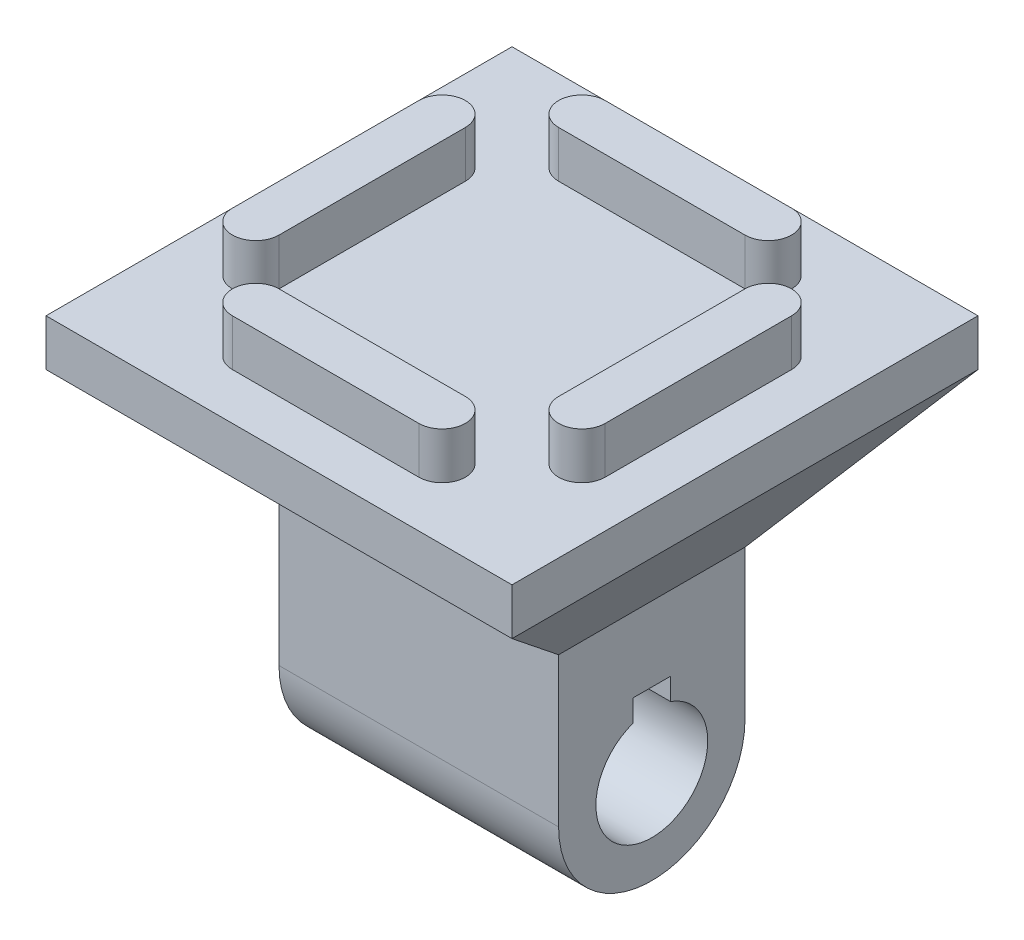
ISO-10303-21;
HEADER;
FILE_DESCRIPTION(('STEP AP214'),'2;1');
FILE_NAME('part.step','',(''),(''),'','','');
FILE_SCHEMA(('AUTOMOTIVE_DESIGN { 1 0 10303 214 1 1 1 1 }'));
ENDSEC;
DATA;
#1=APPLICATION_CONTEXT('core data for automotive mechanical design processes');
#2=APPLICATION_PROTOCOL_DEFINITION('international standard','automotive_design',2000,#1);
#3=PRODUCT_CONTEXT('',#1,'mechanical');
#4=PRODUCT('Part','Part','',(#3));
#5=PRODUCT_RELATED_PRODUCT_CATEGORY('part','',(#4));
#6=PRODUCT_DEFINITION_FORMATION('','',#4);
#7=PRODUCT_DEFINITION_CONTEXT('part definition',#1,'design');
#8=PRODUCT_DEFINITION('design','',#6,#7);
#9=PRODUCT_DEFINITION_SHAPE('','',#8);
#10=(LENGTH_UNIT() NAMED_UNIT(*) SI_UNIT(.MILLI.,.METRE.));
#11=(NAMED_UNIT(*) PLANE_ANGLE_UNIT() SI_UNIT($,.RADIAN.));
#12=(NAMED_UNIT(*) SI_UNIT($,.STERADIAN.) SOLID_ANGLE_UNIT());
#13=UNCERTAINTY_MEASURE_WITH_UNIT(LENGTH_MEASURE(1.E-05),#10,'distance_accuracy_value','');
#14=(GEOMETRIC_REPRESENTATION_CONTEXT(3) GLOBAL_UNCERTAINTY_ASSIGNED_CONTEXT((#13)) GLOBAL_UNIT_ASSIGNED_CONTEXT((#10,
#11,#12)) REPRESENTATION_CONTEXT('',''));
#15=CARTESIAN_POINT('',(0.,0.,0.));
#16=DIRECTION('',(0.,0.,1.));
#17=DIRECTION('',(1.,0.,0.));
#18=AXIS2_PLACEMENT_3D('',#15,#16,#17);
#19=CARTESIAN_POINT('',(0.,5.,0.));
#20=DIRECTION('',(0.,-1.,0.));
#21=DIRECTION('',(0.,0.,-1.));
#22=AXIS2_PLACEMENT_3D('',#19,#20,#21);
#23=PLANE('',#22);
#24=CARTESIAN_POINT('',(17.5,5.,10.));
#25=DIRECTION('',(0.,1.,0.));
#26=DIRECTION('',(0.,0.,-1.));
#27=AXIS2_PLACEMENT_3D('',#24,#25,#26);
#28=CIRCLE('',#27,2.50000000000001);
#29=CARTESIAN_POINT('',(15.,5.,10.));
#30=VERTEX_POINT('',#29);
#31=CARTESIAN_POINT('',(20.,5.,10.));
#32=VERTEX_POINT('',#31);
#33=EDGE_CURVE('E228',#30,#32,#28,.T.);
#34=ORIENTED_EDGE('',*,*,#33,.F.);
#35=DIRECTION('',(0.,0.,1.));
#36=VECTOR('',#35,1.);
#37=CARTESIAN_POINT('',(15.,5.,10.));
#38=LINE('',#37,#36);
#39=CARTESIAN_POINT('',(15.,5.,-10.));
#40=VERTEX_POINT('',#39);
#41=EDGE_CURVE('E233',#40,#30,#38,.T.);
#42=ORIENTED_EDGE('',*,*,#41,.F.);
#43=CARTESIAN_POINT('',(17.5,5.,-10.));
#44=DIRECTION('',(0.,1.,0.));
#45=DIRECTION('',(0.,0.,-1.));
#46=AXIS2_PLACEMENT_3D('',#43,#44,#45);
#47=CIRCLE('',#46,2.50000000000001);
#48=CARTESIAN_POINT('',(20.,5.,-10.));
#49=VERTEX_POINT('',#48);
#50=EDGE_CURVE('E245',#49,#40,#47,.T.);
#51=ORIENTED_EDGE('',*,*,#50,.F.);
#52=DIRECTION('',(0.,0.,-1.));
#53=VECTOR('',#52,1.);
#54=CARTESIAN_POINT('',(20.,5.,10.));
#55=LINE('',#54,#53);
#56=EDGE_CURVE('E242',#32,#49,#55,.T.);
#57=ORIENTED_EDGE('',*,*,#56,.F.);
#58=EDGE_LOOP('',(#34,#42,#51,#57));
#59=FACE_BOUND('',#58,.T.);
#60=CARTESIAN_POINT('',(-17.5,5.,-10.));
#61=DIRECTION('',(0.,1.,0.));
#62=DIRECTION('',(0.,0.,1.));
#63=AXIS2_PLACEMENT_3D('',#60,#61,#62);
#64=CIRCLE('',#63,2.50000000000001);
#65=CARTESIAN_POINT('',(-15.,5.,-10.));
#66=VERTEX_POINT('',#65);
#67=CARTESIAN_POINT('',(-20.,5.,-10.));
#68=VERTEX_POINT('',#67);
#69=EDGE_CURVE('E294',#66,#68,#64,.T.);
#70=ORIENTED_EDGE('',*,*,#69,.F.);
#71=DIRECTION('',(0.,0.,-1.));
#72=VECTOR('',#71,1.);
#73=CARTESIAN_POINT('',(-15.,5.,-10.));
#74=LINE('',#73,#72);
#75=CARTESIAN_POINT('',(-15.,5.,10.));
#76=VERTEX_POINT('',#75);
#77=EDGE_CURVE('E299',#76,#66,#74,.T.);
#78=ORIENTED_EDGE('',*,*,#77,.F.);
#79=CARTESIAN_POINT('',(-17.5,5.,10.));
#80=DIRECTION('',(0.,1.,0.));
#81=DIRECTION('',(0.,0.,1.));
#82=AXIS2_PLACEMENT_3D('',#79,#80,#81);
#83=CIRCLE('',#82,2.50000000000001);
#84=CARTESIAN_POINT('',(-20.,5.,10.));
#85=VERTEX_POINT('',#84);
#86=EDGE_CURVE('E311',#85,#76,#83,.T.);
#87=ORIENTED_EDGE('',*,*,#86,.F.);
#88=DIRECTION('',(0.,0.,1.));
#89=VECTOR('',#88,1.);
#90=CARTESIAN_POINT('',(-20.,5.,-10.));
#91=LINE('',#90,#89);
#92=EDGE_CURVE('E308',#68,#85,#91,.T.);
#93=ORIENTED_EDGE('',*,*,#92,.F.);
#94=EDGE_LOOP('',(#70,#78,#87,#93));
#95=FACE_BOUND('',#94,.T.);
#96=DIRECTION('',(0.,0.,-1.));
#97=VECTOR('',#96,1.);
#98=CARTESIAN_POINT('',(25.,5.,25.));
#99=LINE('',#98,#97);
#100=CARTESIAN_POINT('',(25.,5.,25.));
#101=VERTEX_POINT('',#100);
#102=CARTESIAN_POINT('',(25.,5.,-25.));
#103=VERTEX_POINT('',#102);
#104=EDGE_CURVE('E327',#101,#103,#99,.T.);
#105=ORIENTED_EDGE('',*,*,#104,.T.);
#106=DIRECTION('',(-1.,0.,0.));
#107=VECTOR('',#106,1.);
#108=CARTESIAN_POINT('',(-25.,5.,-25.));
#109=LINE('',#108,#107);
#110=CARTESIAN_POINT('',(-25.,5.,-25.));
#111=VERTEX_POINT('',#110);
#112=EDGE_CURVE('E330',#103,#111,#109,.T.);
#113=ORIENTED_EDGE('',*,*,#112,.T.);
#114=DIRECTION('',(0.,0.,1.));
#115=VECTOR('',#114,1.);
#116=CARTESIAN_POINT('',(-25.,5.,25.));
#117=LINE('',#116,#115);
#118=CARTESIAN_POINT('',(-25.,5.,25.));
#119=VERTEX_POINT('',#118);
#120=EDGE_CURVE('E333',#111,#119,#117,.T.);
#121=ORIENTED_EDGE('',*,*,#120,.T.);
#122=DIRECTION('',(1.,0.,0.));
#123=VECTOR('',#122,1.);
#124=CARTESIAN_POINT('',(-25.,5.,25.));
#125=LINE('',#124,#123);
#126=EDGE_CURVE('E335',#119,#101,#125,.T.);
#127=ORIENTED_EDGE('',*,*,#126,.T.);
#128=EDGE_LOOP('',(#105,#113,#121,#127));
#129=FACE_BOUND('',#128,.T.);
#130=CARTESIAN_POINT('',(-9.99999999999994,5.,17.5));
#131=DIRECTION('',(0.,1.,0.));
#132=DIRECTION('',(1.,0.,0.));
#133=AXIS2_PLACEMENT_3D('',#130,#131,#132);
#134=CIRCLE('',#133,2.50000000000001);
#135=CARTESIAN_POINT('',(-9.99999999999995,5.,15.));
#136=VERTEX_POINT('',#135);
#137=CARTESIAN_POINT('',(-9.99999999999993,5.,20.));
#138=VERTEX_POINT('',#137);
#139=EDGE_CURVE('E261',#136,#138,#134,.T.);
#140=ORIENTED_EDGE('',*,*,#139,.F.);
#141=DIRECTION('',(-1.,0.,0.));
#142=VECTOR('',#141,1.);
#143=CARTESIAN_POINT('',(-9.99999999999995,5.,15.));
#144=LINE('',#143,#142);
#145=CARTESIAN_POINT('',(10.0000000000001,5.,15.));
#146=VERTEX_POINT('',#145);
#147=EDGE_CURVE('E266',#146,#136,#144,.T.);
#148=ORIENTED_EDGE('',*,*,#147,.F.);
#149=CARTESIAN_POINT('',(10.0000000000001,5.,17.5));
#150=DIRECTION('',(0.,1.,0.));
#151=DIRECTION('',(1.,0.,0.));
#152=AXIS2_PLACEMENT_3D('',#149,#150,#151);
#153=CIRCLE('',#152,2.50000000000001);
#154=CARTESIAN_POINT('',(10.0000000000001,5.,20.));
#155=VERTEX_POINT('',#154);
#156=EDGE_CURVE('E278',#155,#146,#153,.T.);
#157=ORIENTED_EDGE('',*,*,#156,.F.);
#158=DIRECTION('',(1.,0.,0.));
#159=VECTOR('',#158,1.);
#160=CARTESIAN_POINT('',(-9.99999999999993,5.,20.));
#161=LINE('',#160,#159);
#162=EDGE_CURVE('E275',#138,#155,#161,.T.);
#163=ORIENTED_EDGE('',*,*,#162,.F.);
#164=EDGE_LOOP('',(#140,#148,#157,#163));
#165=FACE_BOUND('',#164,.T.);
#166=CARTESIAN_POINT('',(9.99999999999982,5.,-17.5000000000001));
#167=DIRECTION('',(0.,1.,0.));
#168=DIRECTION('',(-1.,0.,0.));
#169=AXIS2_PLACEMENT_3D('',#166,#167,#168);
#170=CIRCLE('',#169,2.50000000000001);
#171=CARTESIAN_POINT('',(9.99999999999984,5.,-15.0000000000001));
#172=VERTEX_POINT('',#171);
#173=CARTESIAN_POINT('',(9.99999999999979,5.,-20.0000000000001));
#174=VERTEX_POINT('',#173);
#175=EDGE_CURVE('E202',#172,#174,#170,.T.);
#176=ORIENTED_EDGE('',*,*,#175,.F.);
#177=DIRECTION('',(1.,0.,0.));
#178=VECTOR('',#177,1.);
#179=CARTESIAN_POINT('',(9.99999999999984,5.,-15.0000000000001));
#180=LINE('',#179,#178);
#181=CARTESIAN_POINT('',(-10.0000000000002,5.,-14.9999999999999));
#182=VERTEX_POINT('',#181);
#183=EDGE_CURVE('E198',#182,#172,#180,.T.);
#184=ORIENTED_EDGE('',*,*,#183,.F.);
#185=CARTESIAN_POINT('',(-10.0000000000002,5.,-17.4999999999999));
#186=DIRECTION('',(0.,1.,0.));
#187=DIRECTION('',(-1.,0.,0.));
#188=AXIS2_PLACEMENT_3D('',#185,#186,#187);
#189=CIRCLE('',#188,2.50000000000001);
#190=CARTESIAN_POINT('',(-10.0000000000002,5.,-19.9999999999999));
#191=VERTEX_POINT('',#190);
#192=EDGE_CURVE('E200',#191,#182,#189,.T.);
#193=ORIENTED_EDGE('',*,*,#192,.F.);
#194=DIRECTION('',(-1.,0.,0.));
#195=VECTOR('',#194,1.);
#196=CARTESIAN_POINT('',(9.99999999999979,5.,-20.0000000000001));
#197=LINE('',#196,#195);
#198=EDGE_CURVE('E64',#174,#191,#197,.T.);
#199=ORIENTED_EDGE('',*,*,#198,.F.);
#200=EDGE_LOOP('',(#176,#184,#193,#199));
#201=FACE_BOUND('',#200,.T.);
#202=ADVANCED_FACE('F40',(#59,#95,#129,#165,#201),#23,.F.);
#203=CARTESIAN_POINT('',(25.,5.,25.));
#204=DIRECTION('',(-1.,0.,0.));
#205=DIRECTION('',(0.,0.,1.));
#206=AXIS2_PLACEMENT_3D('',#203,#204,#205);
#207=PLANE('',#206);
#208=DIRECTION('',(0.,0.,1.));
#209=VECTOR('',#208,1.);
#210=CARTESIAN_POINT('',(25.,0.,25.));
#211=LINE('',#210,#209);
#212=CARTESIAN_POINT('',(25.,0.,25.));
#213=VERTEX_POINT('',#212);
#214=CARTESIAN_POINT('',(25.,0.,-25.));
#215=VERTEX_POINT('',#214);
#216=EDGE_CURVE('E87',#213,#215,#211,.F.);
#217=ORIENTED_EDGE('',*,*,#216,.T.);
#218=DIRECTION('',(0.,-1.,0.));
#219=VECTOR('',#218,1.);
#220=CARTESIAN_POINT('',(25.,5.,-25.));
#221=LINE('',#220,#219);
#222=EDGE_CURVE('E341',#103,#215,#221,.T.);
#223=ORIENTED_EDGE('',*,*,#222,.F.);
#224=ORIENTED_EDGE('',*,*,#104,.F.);
#225=DIRECTION('',(0.,-1.,0.));
#226=VECTOR('',#225,1.);
#227=CARTESIAN_POINT('',(25.,5.,25.));
#228=LINE('',#227,#226);
#229=EDGE_CURVE('E337',#101,#213,#228,.T.);
#230=ORIENTED_EDGE('',*,*,#229,.T.);
#231=EDGE_LOOP('',(#217,#223,#224,#230));
#232=FACE_BOUND('',#231,.T.);
#233=ADVANCED_FACE('F42',(#232),#207,.F.);
#234=CARTESIAN_POINT('',(-25.,5.,-25.));
#235=DIRECTION('',(0.,0.,1.));
#236=DIRECTION('',(1.,0.,0.));
#237=AXIS2_PLACEMENT_3D('',#234,#235,#236);
#238=PLANE('',#237);
#239=DIRECTION('',(1.,0.,0.));
#240=VECTOR('',#239,1.);
#241=CARTESIAN_POINT('',(-25.,0.,-25.));
#242=LINE('',#241,#240);
#243=CARTESIAN_POINT('',(-25.,0.,-25.));
#244=VERTEX_POINT('',#243);
#245=EDGE_CURVE('E350',#215,#244,#242,.F.);
#246=ORIENTED_EDGE('',*,*,#245,.T.);
#247=DIRECTION('',(0.,-1.,0.));
#248=VECTOR('',#247,1.);
#249=CARTESIAN_POINT('',(-25.,5.,-25.));
#250=LINE('',#249,#248);
#251=EDGE_CURVE('E338',#111,#244,#250,.T.);
#252=ORIENTED_EDGE('',*,*,#251,.F.);
#253=ORIENTED_EDGE('',*,*,#112,.F.);
#254=ORIENTED_EDGE('',*,*,#222,.T.);
#255=EDGE_LOOP('',(#246,#252,#253,#254));
#256=FACE_BOUND('',#255,.T.);
#257=ADVANCED_FACE('F580',(#256),#238,.F.);
#258=CARTESIAN_POINT('',(-25.,5.,25.));
#259=DIRECTION('',(1.,0.,0.));
#260=DIRECTION('',(0.,0.,-1.));
#261=AXIS2_PLACEMENT_3D('',#258,#259,#260);
#262=PLANE('',#261);
#263=DIRECTION('',(0.,0.,-1.));
#264=VECTOR('',#263,1.);
#265=CARTESIAN_POINT('',(-25.,0.,25.));
#266=LINE('',#265,#264);
#267=CARTESIAN_POINT('',(-25.,0.,25.));
#268=VERTEX_POINT('',#267);
#269=EDGE_CURVE('E353',#244,#268,#266,.F.);
#270=ORIENTED_EDGE('',*,*,#269,.T.);
#271=DIRECTION('',(0.,-1.,0.));
#272=VECTOR('',#271,1.);
#273=CARTESIAN_POINT('',(-25.,5.,25.));
#274=LINE('',#273,#272);
#275=EDGE_CURVE('E342',#119,#268,#274,.T.);
#276=ORIENTED_EDGE('',*,*,#275,.F.);
#277=ORIENTED_EDGE('',*,*,#120,.F.);
#278=ORIENTED_EDGE('',*,*,#251,.T.);
#279=EDGE_LOOP('',(#270,#276,#277,#278));
#280=FACE_BOUND('',#279,.T.);
#281=ADVANCED_FACE('F577',(#280),#262,.F.);
#282=CARTESIAN_POINT('',(-25.,5.,25.));
#283=DIRECTION('',(0.,0.,-1.));
#284=DIRECTION('',(-1.,0.,0.));
#285=AXIS2_PLACEMENT_3D('',#282,#283,#284);
#286=PLANE('',#285);
#287=DIRECTION('',(-1.,0.,0.));
#288=VECTOR('',#287,1.);
#289=CARTESIAN_POINT('',(-25.,0.,25.));
#290=LINE('',#289,#288);
#291=EDGE_CURVE('E331',#268,#213,#290,.F.);
#292=ORIENTED_EDGE('',*,*,#291,.T.);
#293=ORIENTED_EDGE('',*,*,#229,.F.);
#294=ORIENTED_EDGE('',*,*,#126,.F.);
#295=ORIENTED_EDGE('',*,*,#275,.T.);
#296=EDGE_LOOP('',(#292,#293,#294,#295));
#297=FACE_BOUND('',#296,.T.);
#298=ADVANCED_FACE('F570',(#297),#286,.F.);
#299=CARTESIAN_POINT('',(-17.5,10.,-10.));
#300=DIRECTION('',(0.,-1.,0.));
#301=DIRECTION('',(0.,0.,-1.));
#302=AXIS2_PLACEMENT_3D('',#299,#300,#301);
#303=CYLINDRICAL_SURFACE('',#302,2.50000000000001);
#304=ORIENTED_EDGE('',*,*,#69,.T.);
#305=DIRECTION('',(0.,-1.,0.));
#306=VECTOR('',#305,1.);
#307=CARTESIAN_POINT('',(-20.,10.,-10.));
#308=LINE('',#307,#306);
#309=CARTESIAN_POINT('',(-20.,10.,-10.));
#310=VERTEX_POINT('',#309);
#311=EDGE_CURVE('E324',#310,#68,#308,.T.);
#312=ORIENTED_EDGE('',*,*,#311,.F.);
#313=CARTESIAN_POINT('',(-17.5,10.,-10.));
#314=DIRECTION('',(0.,1.,0.));
#315=DIRECTION('',(0.,0.,1.));
#316=AXIS2_PLACEMENT_3D('',#313,#314,#315);
#317=CIRCLE('',#316,2.50000000000001);
#318=CARTESIAN_POINT('',(-15.,10.,-10.));
#319=VERTEX_POINT('',#318);
#320=EDGE_CURVE('E295',#319,#310,#317,.T.);
#321=ORIENTED_EDGE('',*,*,#320,.F.);
#322=DIRECTION('',(0.,-1.,0.));
#323=VECTOR('',#322,1.);
#324=CARTESIAN_POINT('',(-15.,10.,-10.));
#325=LINE('',#324,#323);
#326=EDGE_CURVE('E305',#319,#66,#325,.T.);
#327=ORIENTED_EDGE('',*,*,#326,.T.);
#328=EDGE_LOOP('',(#304,#312,#321,#327));
#329=FACE_BOUND('',#328,.T.);
#330=ADVANCED_FACE('F566',(#329),#303,.T.);
#331=CARTESIAN_POINT('',(-20.,10.,-10.));
#332=DIRECTION('',(1.,0.,0.));
#333=DIRECTION('',(0.,0.,-1.));
#334=AXIS2_PLACEMENT_3D('',#331,#332,#333);
#335=PLANE('',#334);
#336=ORIENTED_EDGE('',*,*,#92,.T.);
#337=DIRECTION('',(0.,-1.,0.));
#338=VECTOR('',#337,1.);
#339=CARTESIAN_POINT('',(-20.,10.,10.));
#340=LINE('',#339,#338);
#341=CARTESIAN_POINT('',(-20.,10.,10.));
#342=VERTEX_POINT('',#341);
#343=EDGE_CURVE('E321',#342,#85,#340,.T.);
#344=ORIENTED_EDGE('',*,*,#343,.F.);
#345=DIRECTION('',(0.,0.,1.));
#346=VECTOR('',#345,1.);
#347=CARTESIAN_POINT('',(-20.,10.,-10.));
#348=LINE('',#347,#346);
#349=EDGE_CURVE('E298',#310,#342,#348,.T.);
#350=ORIENTED_EDGE('',*,*,#349,.F.);
#351=ORIENTED_EDGE('',*,*,#311,.T.);
#352=EDGE_LOOP('',(#336,#344,#350,#351));
#353=FACE_BOUND('',#352,.T.);
#354=ADVANCED_FACE('F562',(#353),#335,.F.);
#355=CARTESIAN_POINT('',(-17.5,10.,10.));
#356=DIRECTION('',(0.,-1.,0.));
#357=DIRECTION('',(0.,0.,-1.));
#358=AXIS2_PLACEMENT_3D('',#355,#356,#357);
#359=CYLINDRICAL_SURFACE('',#358,2.50000000000001);
#360=ORIENTED_EDGE('',*,*,#86,.T.);
#361=DIRECTION('',(0.,-1.,0.));
#362=VECTOR('',#361,1.);
#363=CARTESIAN_POINT('',(-15.,10.,10.));
#364=LINE('',#363,#362);
#365=CARTESIAN_POINT('',(-15.,10.,10.));
#366=VERTEX_POINT('',#365);
#367=EDGE_CURVE('E318',#366,#76,#364,.T.);
#368=ORIENTED_EDGE('',*,*,#367,.F.);
#369=CARTESIAN_POINT('',(-17.5,10.,10.));
#370=DIRECTION('',(0.,1.,0.));
#371=DIRECTION('',(0.,0.,1.));
#372=AXIS2_PLACEMENT_3D('',#369,#370,#371);
#373=CIRCLE('',#372,2.50000000000001);
#374=EDGE_CURVE('E301',#342,#366,#373,.T.);
#375=ORIENTED_EDGE('',*,*,#374,.F.);
#376=ORIENTED_EDGE('',*,*,#343,.T.);
#377=EDGE_LOOP('',(#360,#368,#375,#376));
#378=FACE_BOUND('',#377,.T.);
#379=ADVANCED_FACE('F558',(#378),#359,.T.);
#380=CARTESIAN_POINT('',(-15.,10.,-10.));
#381=DIRECTION('',(-1.,0.,0.));
#382=DIRECTION('',(0.,0.,1.));
#383=AXIS2_PLACEMENT_3D('',#380,#381,#382);
#384=PLANE('',#383);
#385=ORIENTED_EDGE('',*,*,#77,.T.);
#386=ORIENTED_EDGE('',*,*,#326,.F.);
#387=DIRECTION('',(0.,0.,-1.));
#388=VECTOR('',#387,1.);
#389=CARTESIAN_POINT('',(-15.,10.,-10.));
#390=LINE('',#389,#388);
#391=EDGE_CURVE('E303',#366,#319,#390,.T.);
#392=ORIENTED_EDGE('',*,*,#391,.F.);
#393=ORIENTED_EDGE('',*,*,#367,.T.);
#394=EDGE_LOOP('',(#385,#386,#392,#393));
#395=FACE_BOUND('',#394,.T.);
#396=ADVANCED_FACE('F554',(#395),#384,.F.);
#397=CARTESIAN_POINT('',(-17.5,10.,-10.));
#398=DIRECTION('',(0.,1.,0.));
#399=DIRECTION('',(0.,0.,1.));
#400=AXIS2_PLACEMENT_3D('',#397,#398,#399);
#401=PLANE('',#400);
#402=ORIENTED_EDGE('',*,*,#320,.T.);
#403=ORIENTED_EDGE('',*,*,#349,.T.);
#404=ORIENTED_EDGE('',*,*,#374,.T.);
#405=ORIENTED_EDGE('',*,*,#391,.T.);
#406=EDGE_LOOP('',(#402,#403,#404,#405));
#407=FACE_BOUND('',#406,.T.);
#408=ADVANCED_FACE('F550',(#407),#401,.T.);
#409=CARTESIAN_POINT('',(-9.99999999999994,10.,17.5));
#410=DIRECTION('',(0.,-1.,0.));
#411=DIRECTION('',(0.,0.,-1.));
#412=AXIS2_PLACEMENT_3D('',#409,#410,#411);
#413=CYLINDRICAL_SURFACE('',#412,2.50000000000001);
#414=ORIENTED_EDGE('',*,*,#139,.T.);
#415=DIRECTION('',(0.,-1.,0.));
#416=VECTOR('',#415,1.);
#417=CARTESIAN_POINT('',(-9.99999999999993,10.,20.));
#418=LINE('',#417,#416);
#419=CARTESIAN_POINT('',(-9.99999999999993,10.,20.));
#420=VERTEX_POINT('',#419);
#421=EDGE_CURVE('E291',#420,#138,#418,.T.);
#422=ORIENTED_EDGE('',*,*,#421,.F.);
#423=CARTESIAN_POINT('',(-9.99999999999994,10.,17.5));
#424=DIRECTION('',(0.,1.,0.));
#425=DIRECTION('',(1.,0.,0.));
#426=AXIS2_PLACEMENT_3D('',#423,#424,#425);
#427=CIRCLE('',#426,2.50000000000001);
#428=CARTESIAN_POINT('',(-9.99999999999995,10.,15.));
#429=VERTEX_POINT('',#428);
#430=EDGE_CURVE('E262',#429,#420,#427,.T.);
#431=ORIENTED_EDGE('',*,*,#430,.F.);
#432=DIRECTION('',(0.,-1.,0.));
#433=VECTOR('',#432,1.);
#434=CARTESIAN_POINT('',(-9.99999999999995,10.,15.));
#435=LINE('',#434,#433);
#436=EDGE_CURVE('E272',#429,#136,#435,.T.);
#437=ORIENTED_EDGE('',*,*,#436,.T.);
#438=EDGE_LOOP('',(#414,#422,#431,#437));
#439=FACE_BOUND('',#438,.T.);
#440=ADVANCED_FACE('F546',(#439),#413,.T.);
#441=CARTESIAN_POINT('',(-9.99999999999993,10.,20.));
#442=DIRECTION('',(0.,0.,-1.));
#443=DIRECTION('',(-1.,0.,0.));
#444=AXIS2_PLACEMENT_3D('',#441,#442,#443);
#445=PLANE('',#444);
#446=ORIENTED_EDGE('',*,*,#162,.T.);
#447=DIRECTION('',(0.,-1.,0.));
#448=VECTOR('',#447,1.);
#449=CARTESIAN_POINT('',(10.0000000000001,10.,20.));
#450=LINE('',#449,#448);
#451=CARTESIAN_POINT('',(10.0000000000001,10.,20.));
#452=VERTEX_POINT('',#451);
#453=EDGE_CURVE('E288',#452,#155,#450,.T.);
#454=ORIENTED_EDGE('',*,*,#453,.F.);
#455=DIRECTION('',(1.,0.,0.));
#456=VECTOR('',#455,1.);
#457=CARTESIAN_POINT('',(-9.99999999999993,10.,20.));
#458=LINE('',#457,#456);
#459=EDGE_CURVE('E265',#420,#452,#458,.T.);
#460=ORIENTED_EDGE('',*,*,#459,.F.);
#461=ORIENTED_EDGE('',*,*,#421,.T.);
#462=EDGE_LOOP('',(#446,#454,#460,#461));
#463=FACE_BOUND('',#462,.T.);
#464=ADVANCED_FACE('F542',(#463),#445,.F.);
#465=CARTESIAN_POINT('',(10.0000000000001,10.,17.5));
#466=DIRECTION('',(0.,-1.,0.));
#467=DIRECTION('',(0.,0.,-1.));
#468=AXIS2_PLACEMENT_3D('',#465,#466,#467);
#469=CYLINDRICAL_SURFACE('',#468,2.50000000000001);
#470=ORIENTED_EDGE('',*,*,#156,.T.);
#471=DIRECTION('',(0.,-1.,0.));
#472=VECTOR('',#471,1.);
#473=CARTESIAN_POINT('',(10.0000000000001,10.,15.));
#474=LINE('',#473,#472);
#475=CARTESIAN_POINT('',(10.0000000000001,10.,15.));
#476=VERTEX_POINT('',#475);
#477=EDGE_CURVE('E285',#476,#146,#474,.T.);
#478=ORIENTED_EDGE('',*,*,#477,.F.);
#479=CARTESIAN_POINT('',(10.0000000000001,10.,17.5));
#480=DIRECTION('',(0.,1.,0.));
#481=DIRECTION('',(1.,0.,0.));
#482=AXIS2_PLACEMENT_3D('',#479,#480,#481);
#483=CIRCLE('',#482,2.50000000000001);
#484=EDGE_CURVE('E268',#452,#476,#483,.T.);
#485=ORIENTED_EDGE('',*,*,#484,.F.);
#486=ORIENTED_EDGE('',*,*,#453,.T.);
#487=EDGE_LOOP('',(#470,#478,#485,#486));
#488=FACE_BOUND('',#487,.T.);
#489=ADVANCED_FACE('F538',(#488),#469,.T.);
#490=CARTESIAN_POINT('',(-9.99999999999995,10.,15.));
#491=DIRECTION('',(0.,0.,1.));
#492=DIRECTION('',(1.,0.,0.));
#493=AXIS2_PLACEMENT_3D('',#490,#491,#492);
#494=PLANE('',#493);
#495=ORIENTED_EDGE('',*,*,#147,.T.);
#496=ORIENTED_EDGE('',*,*,#436,.F.);
#497=DIRECTION('',(-1.,0.,0.));
#498=VECTOR('',#497,1.);
#499=CARTESIAN_POINT('',(-9.99999999999995,10.,15.));
#500=LINE('',#499,#498);
#501=EDGE_CURVE('E270',#476,#429,#500,.T.);
#502=ORIENTED_EDGE('',*,*,#501,.F.);
#503=ORIENTED_EDGE('',*,*,#477,.T.);
#504=EDGE_LOOP('',(#495,#496,#502,#503));
#505=FACE_BOUND('',#504,.T.);
#506=ADVANCED_FACE('F534',(#505),#494,.F.);
#507=CARTESIAN_POINT('',(-9.99999999999994,10.,17.5));
#508=DIRECTION('',(0.,1.,0.));
#509=DIRECTION('',(1.,0.,0.));
#510=AXIS2_PLACEMENT_3D('',#507,#508,#509);
#511=PLANE('',#510);
#512=ORIENTED_EDGE('',*,*,#430,.T.);
#513=ORIENTED_EDGE('',*,*,#459,.T.);
#514=ORIENTED_EDGE('',*,*,#484,.T.);
#515=ORIENTED_EDGE('',*,*,#501,.T.);
#516=EDGE_LOOP('',(#512,#513,#514,#515));
#517=FACE_BOUND('',#516,.T.);
#518=ADVANCED_FACE('F530',(#517),#511,.T.);
#519=CARTESIAN_POINT('',(17.5,10.,10.));
#520=DIRECTION('',(0.,-1.,0.));
#521=DIRECTION('',(0.,0.,-1.));
#522=AXIS2_PLACEMENT_3D('',#519,#520,#521);
#523=CYLINDRICAL_SURFACE('',#522,2.50000000000001);
#524=ORIENTED_EDGE('',*,*,#33,.T.);
#525=DIRECTION('',(0.,-1.,0.));
#526=VECTOR('',#525,1.);
#527=CARTESIAN_POINT('',(20.,10.,10.));
#528=LINE('',#527,#526);
#529=CARTESIAN_POINT('',(20.,10.,10.));
#530=VERTEX_POINT('',#529);
#531=EDGE_CURVE('E258',#530,#32,#528,.T.);
#532=ORIENTED_EDGE('',*,*,#531,.F.);
#533=CARTESIAN_POINT('',(17.5,10.,10.));
#534=DIRECTION('',(0.,1.,0.));
#535=DIRECTION('',(0.,0.,-1.));
#536=AXIS2_PLACEMENT_3D('',#533,#534,#535);
#537=CIRCLE('',#536,2.50000000000001);
#538=CARTESIAN_POINT('',(15.,10.,10.));
#539=VERTEX_POINT('',#538);
#540=EDGE_CURVE('E229',#539,#530,#537,.T.);
#541=ORIENTED_EDGE('',*,*,#540,.F.);
#542=DIRECTION('',(0.,-1.,0.));
#543=VECTOR('',#542,1.);
#544=CARTESIAN_POINT('',(15.,10.,10.));
#545=LINE('',#544,#543);
#546=EDGE_CURVE('E239',#539,#30,#545,.T.);
#547=ORIENTED_EDGE('',*,*,#546,.T.);
#548=EDGE_LOOP('',(#524,#532,#541,#547));
#549=FACE_BOUND('',#548,.T.);
#550=ADVANCED_FACE('F526',(#549),#523,.T.);
#551=CARTESIAN_POINT('',(20.,10.,10.));
#552=DIRECTION('',(-1.,0.,0.));
#553=DIRECTION('',(0.,0.,1.));
#554=AXIS2_PLACEMENT_3D('',#551,#552,#553);
#555=PLANE('',#554);
#556=ORIENTED_EDGE('',*,*,#56,.T.);
#557=DIRECTION('',(0.,-1.,0.));
#558=VECTOR('',#557,1.);
#559=CARTESIAN_POINT('',(20.,10.,-10.));
#560=LINE('',#559,#558);
#561=CARTESIAN_POINT('',(20.,10.,-10.));
#562=VERTEX_POINT('',#561);
#563=EDGE_CURVE('E255',#562,#49,#560,.T.);
#564=ORIENTED_EDGE('',*,*,#563,.F.);
#565=DIRECTION('',(0.,0.,-1.));
#566=VECTOR('',#565,1.);
#567=CARTESIAN_POINT('',(20.,10.,10.));
#568=LINE('',#567,#566);
#569=EDGE_CURVE('E232',#530,#562,#568,.T.);
#570=ORIENTED_EDGE('',*,*,#569,.F.);
#571=ORIENTED_EDGE('',*,*,#531,.T.);
#572=EDGE_LOOP('',(#556,#564,#570,#571));
#573=FACE_BOUND('',#572,.T.);
#574=ADVANCED_FACE('F522',(#573),#555,.F.);
#575=CARTESIAN_POINT('',(17.5,10.,-10.));
#576=DIRECTION('',(0.,-1.,0.));
#577=DIRECTION('',(0.,0.,-1.));
#578=AXIS2_PLACEMENT_3D('',#575,#576,#577);
#579=CYLINDRICAL_SURFACE('',#578,2.50000000000001);
#580=ORIENTED_EDGE('',*,*,#50,.T.);
#581=DIRECTION('',(0.,-1.,0.));
#582=VECTOR('',#581,1.);
#583=CARTESIAN_POINT('',(15.,10.,-10.));
#584=LINE('',#583,#582);
#585=CARTESIAN_POINT('',(15.,10.,-10.));
#586=VERTEX_POINT('',#585);
#587=EDGE_CURVE('E252',#586,#40,#584,.T.);
#588=ORIENTED_EDGE('',*,*,#587,.F.);
#589=CARTESIAN_POINT('',(17.5,10.,-10.));
#590=DIRECTION('',(0.,1.,0.));
#591=DIRECTION('',(0.,0.,-1.));
#592=AXIS2_PLACEMENT_3D('',#589,#590,#591);
#593=CIRCLE('',#592,2.50000000000001);
#594=EDGE_CURVE('E235',#562,#586,#593,.T.);
#595=ORIENTED_EDGE('',*,*,#594,.F.);
#596=ORIENTED_EDGE('',*,*,#563,.T.);
#597=EDGE_LOOP('',(#580,#588,#595,#596));
#598=FACE_BOUND('',#597,.T.);
#599=ADVANCED_FACE('F518',(#598),#579,.T.);
#600=CARTESIAN_POINT('',(15.,10.,10.));
#601=DIRECTION('',(1.,0.,0.));
#602=DIRECTION('',(0.,0.,-1.));
#603=AXIS2_PLACEMENT_3D('',#600,#601,#602);
#604=PLANE('',#603);
#605=ORIENTED_EDGE('',*,*,#41,.T.);
#606=ORIENTED_EDGE('',*,*,#546,.F.);
#607=DIRECTION('',(0.,0.,1.));
#608=VECTOR('',#607,1.);
#609=CARTESIAN_POINT('',(15.,10.,10.));
#610=LINE('',#609,#608);
#611=EDGE_CURVE('E237',#586,#539,#610,.T.);
#612=ORIENTED_EDGE('',*,*,#611,.F.);
#613=ORIENTED_EDGE('',*,*,#587,.T.);
#614=EDGE_LOOP('',(#605,#606,#612,#613));
#615=FACE_BOUND('',#614,.T.);
#616=ADVANCED_FACE('F514',(#615),#604,.F.);
#617=CARTESIAN_POINT('',(17.5,10.,10.));
#618=DIRECTION('',(0.,1.,0.));
#619=DIRECTION('',(0.,0.,-1.));
#620=AXIS2_PLACEMENT_3D('',#617,#618,#619);
#621=PLANE('',#620);
#622=ORIENTED_EDGE('',*,*,#540,.T.);
#623=ORIENTED_EDGE('',*,*,#569,.T.);
#624=ORIENTED_EDGE('',*,*,#594,.T.);
#625=ORIENTED_EDGE('',*,*,#611,.T.);
#626=EDGE_LOOP('',(#622,#623,#624,#625));
#627=FACE_BOUND('',#626,.T.);
#628=ADVANCED_FACE('F510',(#627),#621,.T.);
#629=CARTESIAN_POINT('',(9.99999999999982,10.,-17.5000000000001));
#630=DIRECTION('',(0.,-1.,0.));
#631=DIRECTION('',(0.,0.,-1.));
#632=AXIS2_PLACEMENT_3D('',#629,#630,#631);
#633=CYLINDRICAL_SURFACE('',#632,2.50000000000001);
#634=ORIENTED_EDGE('',*,*,#175,.T.);
#635=DIRECTION('',(0.,-1.,0.));
#636=VECTOR('',#635,1.);
#637=CARTESIAN_POINT('',(9.99999999999979,10.,-20.0000000000001));
#638=LINE('',#637,#636);
#639=CARTESIAN_POINT('',(9.99999999999979,10.,-20.0000000000001));
#640=VERTEX_POINT('',#639);
#641=EDGE_CURVE('E223',#640,#174,#638,.T.);
#642=ORIENTED_EDGE('',*,*,#641,.F.);
#643=CARTESIAN_POINT('',(9.99999999999982,10.,-17.5000000000001));
#644=DIRECTION('',(0.,1.,0.));
#645=DIRECTION('',(-1.,0.,0.));
#646=AXIS2_PLACEMENT_3D('',#643,#644,#645);
#647=CIRCLE('',#646,2.50000000000001);
#648=CARTESIAN_POINT('',(9.99999999999984,10.,-15.0000000000001));
#649=VERTEX_POINT('',#648);
#650=EDGE_CURVE('E207',#649,#640,#647,.T.);
#651=ORIENTED_EDGE('',*,*,#650,.F.);
#652=DIRECTION('',(0.,-1.,0.));
#653=VECTOR('',#652,1.);
#654=CARTESIAN_POINT('',(9.99999999999984,10.,-15.0000000000001));
#655=LINE('',#654,#653);
#656=EDGE_CURVE('E221',#649,#172,#655,.T.);
#657=ORIENTED_EDGE('',*,*,#656,.T.);
#658=EDGE_LOOP('',(#634,#642,#651,#657));
#659=FACE_BOUND('',#658,.T.);
#660=ADVANCED_FACE('F506',(#659),#633,.T.);
#661=CARTESIAN_POINT('',(9.99999999999979,10.,-20.0000000000001));
#662=DIRECTION('',(0.,0.,1.));
#663=DIRECTION('',(1.,0.,0.));
#664=AXIS2_PLACEMENT_3D('',#661,#662,#663);
#665=PLANE('',#664);
#666=ORIENTED_EDGE('',*,*,#198,.T.);
#667=DIRECTION('',(0.,-1.,0.));
#668=VECTOR('',#667,1.);
#669=CARTESIAN_POINT('',(-10.0000000000002,10.,-19.9999999999999));
#670=LINE('',#669,#668);
#671=CARTESIAN_POINT('',(-10.0000000000002,10.,-19.9999999999999));
#672=VERTEX_POINT('',#671);
#673=EDGE_CURVE('E217',#672,#191,#670,.T.);
#674=ORIENTED_EDGE('',*,*,#673,.F.);
#675=DIRECTION('',(-1.,0.,0.));
#676=VECTOR('',#675,1.);
#677=CARTESIAN_POINT('',(9.99999999999979,10.,-20.0000000000001));
#678=LINE('',#677,#676);
#679=EDGE_CURVE('E951',#640,#672,#678,.T.);
#680=ORIENTED_EDGE('',*,*,#679,.F.);
#681=ORIENTED_EDGE('',*,*,#641,.T.);
#682=EDGE_LOOP('',(#666,#674,#680,#681));
#683=FACE_BOUND('',#682,.T.);
#684=ADVANCED_FACE('F503',(#683),#665,.F.);
#685=CARTESIAN_POINT('',(-10.0000000000002,10.,-17.4999999999999));
#686=DIRECTION('',(0.,-1.,0.));
#687=DIRECTION('',(0.,0.,-1.));
#688=AXIS2_PLACEMENT_3D('',#685,#686,#687);
#689=CYLINDRICAL_SURFACE('',#688,2.50000000000001);
#690=ORIENTED_EDGE('',*,*,#192,.T.);
#691=DIRECTION('',(0.,-1.,0.));
#692=VECTOR('',#691,1.);
#693=CARTESIAN_POINT('',(-10.0000000000002,10.,-14.9999999999999));
#694=LINE('',#693,#692);
#695=CARTESIAN_POINT('',(-10.0000000000002,10.,-14.9999999999999));
#696=VERTEX_POINT('',#695);
#697=EDGE_CURVE('E214',#696,#182,#694,.T.);
#698=ORIENTED_EDGE('',*,*,#697,.F.);
#699=CARTESIAN_POINT('',(-10.0000000000002,10.,-17.4999999999999));
#700=DIRECTION('',(0.,1.,0.));
#701=DIRECTION('',(-1.,0.,0.));
#702=AXIS2_PLACEMENT_3D('',#699,#700,#701);
#703=CIRCLE('',#702,2.50000000000001);
#704=EDGE_CURVE('E949',#672,#696,#703,.T.);
#705=ORIENTED_EDGE('',*,*,#704,.F.);
#706=ORIENTED_EDGE('',*,*,#673,.T.);
#707=EDGE_LOOP('',(#690,#698,#705,#706));
#708=FACE_BOUND('',#707,.T.);
#709=ADVANCED_FACE('F212',(#708),#689,.T.);
#710=CARTESIAN_POINT('',(9.99999999999984,10.,-15.0000000000001));
#711=DIRECTION('',(0.,0.,-1.));
#712=DIRECTION('',(-1.,0.,0.));
#713=AXIS2_PLACEMENT_3D('',#710,#711,#712);
#714=PLANE('',#713);
#715=ORIENTED_EDGE('',*,*,#183,.T.);
#716=ORIENTED_EDGE('',*,*,#656,.F.);
#717=DIRECTION('',(1.,0.,0.));
#718=VECTOR('',#717,1.);
#719=CARTESIAN_POINT('',(9.99999999999984,10.,-15.0000000000001));
#720=LINE('',#719,#718);
#721=EDGE_CURVE('E220',#696,#649,#720,.T.);
#722=ORIENTED_EDGE('',*,*,#721,.F.);
#723=ORIENTED_EDGE('',*,*,#697,.T.);
#724=EDGE_LOOP('',(#715,#716,#722,#723));
#725=FACE_BOUND('',#724,.T.);
#726=ADVANCED_FACE('F219',(#725),#714,.F.);
#727=CARTESIAN_POINT('',(9.99999999999982,10.,-17.5000000000001));
#728=DIRECTION('',(0.,1.,0.));
#729=DIRECTION('',(-1.,0.,0.));
#730=AXIS2_PLACEMENT_3D('',#727,#728,#729);
#731=PLANE('',#730);
#732=ORIENTED_EDGE('',*,*,#650,.T.);
#733=ORIENTED_EDGE('',*,*,#679,.T.);
#734=ORIENTED_EDGE('',*,*,#704,.T.);
#735=ORIENTED_EDGE('',*,*,#721,.T.);
#736=EDGE_LOOP('',(#732,#733,#734,#735));
#737=FACE_BOUND('',#736,.T.);
#738=ADVANCED_FACE('F494',(#737),#731,.T.);
#739=CARTESIAN_POINT('',(0.,-12.4703087885986,11.6389548693587));
#740=DIRECTION('',(0.,0.731055268242869,-0.682318250360011));
#741=DIRECTION('',(0.,0.682318250360011,0.731055268242869));
#742=AXIS2_PLACEMENT_3D('',#739,#740,#741);
#743=PLANE('',#742);
#744=DIRECTION('',(0.438107954338323,0.613351136073653,0.657161931507485));
#745=VECTOR('',#744,1.);
#746=CARTESIAN_POINT('',(15.,-14.,10.));
#747=LINE('',#746,#745);
#748=CARTESIAN_POINT('',(15.,-14.,10.));
#749=VERTEX_POINT('',#748);
#750=EDGE_CURVE('E413',#749,#213,#747,.T.);
#751=ORIENTED_EDGE('',*,*,#750,.T.);
#752=ORIENTED_EDGE('',*,*,#291,.F.);
#753=DIRECTION('',(-0.438107954338324,0.613351136073653,0.657161931507485));
#754=VECTOR('',#753,1.);
#755=CARTESIAN_POINT('',(-15.,-14.,10.));
#756=LINE('',#755,#754);
#757=CARTESIAN_POINT('',(-15.,-14.,10.));
#758=VERTEX_POINT('',#757);
#759=EDGE_CURVE('E601',#758,#268,#756,.T.);
#760=ORIENTED_EDGE('',*,*,#759,.F.);
#761=DIRECTION('',(-1.,0.,0.));
#762=VECTOR('',#761,1.);
#763=CARTESIAN_POINT('',(15.,-14.,10.));
#764=LINE('',#763,#762);
#765=EDGE_CURVE('E372',#749,#758,#764,.T.);
#766=ORIENTED_EDGE('',*,*,#765,.F.);
#767=EDGE_LOOP('',(#751,#752,#760,#766));
#768=FACE_BOUND('',#767,.T.);
#769=ADVANCED_FACE('F497',(#768),#743,.F.);
#770=CARTESIAN_POINT('',(-16.554054054054,-11.8243243243243,0.));
#771=DIRECTION('',(-0.813733471206735,-0.581238193719097,0.));
#772=DIRECTION('',(0.581238193719097,-0.813733471206735,0.));
#773=AXIS2_PLACEMENT_3D('',#770,#771,#772);
#774=PLANE('',#773);
#775=ORIENTED_EDGE('',*,*,#759,.T.);
#776=ORIENTED_EDGE('',*,*,#269,.F.);
#777=DIRECTION('',(-0.438107954338324,0.613351136073653,-0.657161931507485));
#778=VECTOR('',#777,1.);
#779=CARTESIAN_POINT('',(-15.,-14.,-10.));
#780=LINE('',#779,#778);
#781=CARTESIAN_POINT('',(-15.,-14.,-10.));
#782=VERTEX_POINT('',#781);
#783=EDGE_CURVE('E95',#782,#244,#780,.T.);
#784=ORIENTED_EDGE('',*,*,#783,.F.);
#785=DIRECTION('',(0.,0.,-1.));
#786=VECTOR('',#785,1.);
#787=CARTESIAN_POINT('',(-15.,-14.,10.));
#788=LINE('',#787,#786);
#789=EDGE_CURVE('E428',#758,#782,#788,.T.);
#790=ORIENTED_EDGE('',*,*,#789,.F.);
#791=EDGE_LOOP('',(#775,#776,#784,#790));
#792=FACE_BOUND('',#791,.T.);
#793=ADVANCED_FACE('F602',(#792),#774,.T.);
#794=CARTESIAN_POINT('',(16.5540540540541,-11.8243243243243,0.));
#795=DIRECTION('',(0.813733471206735,-0.581238193719096,0.));
#796=DIRECTION('',(0.581238193719096,0.813733471206735,0.));
#797=AXIS2_PLACEMENT_3D('',#794,#795,#796);
#798=PLANE('',#797);
#799=DIRECTION('',(0.438107954338323,0.613351136073653,-0.657161931507485));
#800=VECTOR('',#799,1.);
#801=CARTESIAN_POINT('',(15.,-14.,-10.));
#802=LINE('',#801,#800);
#803=CARTESIAN_POINT('',(15.,-14.,-10.));
#804=VERTEX_POINT('',#803);
#805=EDGE_CURVE('E604',#804,#215,#802,.T.);
#806=ORIENTED_EDGE('',*,*,#805,.T.);
#807=ORIENTED_EDGE('',*,*,#216,.F.);
#808=ORIENTED_EDGE('',*,*,#750,.F.);
#809=DIRECTION('',(0.,0.,1.));
#810=VECTOR('',#809,1.);
#811=CARTESIAN_POINT('',(15.,-14.,10.));
#812=LINE('',#811,#810);
#813=EDGE_CURVE('E414',#804,#749,#812,.T.);
#814=ORIENTED_EDGE('',*,*,#813,.F.);
#815=EDGE_LOOP('',(#806,#807,#808,#814));
#816=FACE_BOUND('',#815,.T.);
#817=ADVANCED_FACE('F491',(#816),#798,.T.);
#818=CARTESIAN_POINT('',(0.,-12.4703087885986,-11.6389548693587));
#819=DIRECTION('',(0.,0.731055268242869,0.682318250360011));
#820=DIRECTION('',(0.,-0.682318250360011,0.731055268242869));
#821=AXIS2_PLACEMENT_3D('',#818,#819,#820);
#822=PLANE('',#821);
#823=ORIENTED_EDGE('',*,*,#783,.T.);
#824=ORIENTED_EDGE('',*,*,#245,.F.);
#825=ORIENTED_EDGE('',*,*,#805,.F.);
#826=DIRECTION('',(1.,0.,0.));
#827=VECTOR('',#826,1.);
#828=CARTESIAN_POINT('',(15.,-14.,-10.));
#829=LINE('',#828,#827);
#830=EDGE_CURVE('E405',#782,#804,#829,.T.);
#831=ORIENTED_EDGE('',*,*,#830,.F.);
#832=EDGE_LOOP('',(#823,#824,#825,#831));
#833=FACE_BOUND('',#832,.T.);
#834=ADVANCED_FACE('F481',(#833),#822,.F.);
#835=CARTESIAN_POINT('',(15.,-30.,0.));
#836=DIRECTION('',(-1.,0.,0.));
#837=DIRECTION('',(0.,0.,1.));
#838=AXIS2_PLACEMENT_3D('',#835,#836,#837);
#839=CYLINDRICAL_SURFACE('',#838,10.);
#840=DIRECTION('',(-1.,0.,0.));
#841=VECTOR('',#840,1.);
#842=CARTESIAN_POINT('',(15.,-30.,-10.));
#843=LINE('',#842,#841);
#844=CARTESIAN_POINT('',(-15.,-30.,-10.));
#845=VERTEX_POINT('',#844);
#846=CARTESIAN_POINT('',(15.,-30.,-10.));
#847=VERTEX_POINT('',#846);
#848=EDGE_CURVE('E465',#845,#847,#843,.F.);
#849=ORIENTED_EDGE('',*,*,#848,.T.);
#850=CARTESIAN_POINT('',(15.,-30.,0.));
#851=DIRECTION('',(1.,0.,0.));
#852=DIRECTION('',(0.,0.,-1.));
#853=AXIS2_PLACEMENT_3D('',#850,#851,#852);
#854=CIRCLE('',#853,10.);
#855=CARTESIAN_POINT('',(15.,-30.,10.));
#856=VERTEX_POINT('',#855);
#857=EDGE_CURVE('E431',#856,#847,#854,.T.);
#858=ORIENTED_EDGE('',*,*,#857,.F.);
#859=DIRECTION('',(-1.,0.,0.));
#860=VECTOR('',#859,1.);
#861=CARTESIAN_POINT('',(15.,-30.,10.));
#862=LINE('',#861,#860);
#863=CARTESIAN_POINT('',(-15.,-30.,10.));
#864=VERTEX_POINT('',#863);
#865=EDGE_CURVE('E649',#864,#856,#862,.F.);
#866=ORIENTED_EDGE('',*,*,#865,.F.);
#867=CARTESIAN_POINT('',(-15.,-30.,0.));
#868=DIRECTION('',(1.,0.,0.));
#869=DIRECTION('',(0.,0.,-1.));
#870=AXIS2_PLACEMENT_3D('',#867,#868,#869);
#871=CIRCLE('',#870,10.);
#872=EDGE_CURVE('E460',#864,#845,#871,.T.);
#873=ORIENTED_EDGE('',*,*,#872,.T.);
#874=EDGE_LOOP('',(#849,#858,#866,#873));
#875=FACE_BOUND('',#874,.T.);
#876=ADVANCED_FACE('F490',(#875),#839,.T.);
#877=CARTESIAN_POINT('',(15.,-30.,0.));
#878=DIRECTION('',(1.,0.,0.));
#879=DIRECTION('',(0.,0.,-1.));
#880=AXIS2_PLACEMENT_3D('',#877,#878,#879);
#881=PLANE('',#880);
#882=DIRECTION('',(0.,1.,0.));
#883=VECTOR('',#882,1.);
#884=CARTESIAN_POINT('',(15.,-26.,2.));
#885=LINE('',#884,#883);
#886=CARTESIAN_POINT('',(15.,-24.3431457505076,2.));
#887=VERTEX_POINT('',#886);
#888=CARTESIAN_POINT('',(15.,-22.,2.));
#889=VERTEX_POINT('',#888);
#890=EDGE_CURVE('E665',#887,#889,#885,.T.);
#891=ORIENTED_EDGE('',*,*,#890,.T.);
#892=DIRECTION('',(0.,0.,-1.));
#893=VECTOR('',#892,1.);
#894=CARTESIAN_POINT('',(15.,-22.,-2.));
#895=LINE('',#894,#893);
#896=CARTESIAN_POINT('',(15.,-22.,-2.));
#897=VERTEX_POINT('',#896);
#898=EDGE_CURVE('E456',#889,#897,#895,.T.);
#899=ORIENTED_EDGE('',*,*,#898,.T.);
#900=DIRECTION('',(0.,-1.,0.));
#901=VECTOR('',#900,1.);
#902=CARTESIAN_POINT('',(15.,-26.,-2.));
#903=LINE('',#902,#901);
#904=CARTESIAN_POINT('',(15.,-24.3431457505076,-2.));
#905=VERTEX_POINT('',#904);
#906=EDGE_CURVE('E441',#897,#905,#903,.T.);
#907=ORIENTED_EDGE('',*,*,#906,.T.);
#908=CARTESIAN_POINT('',(15.,-30.,0.));
#909=DIRECTION('',(1.,0.,0.));
#910=DIRECTION('',(0.,0.,-1.));
#911=AXIS2_PLACEMENT_3D('',#908,#909,#910);
#912=CIRCLE('',#911,6.);
#913=EDGE_CURVE('E454',#887,#905,#912,.T.);
#914=ORIENTED_EDGE('',*,*,#913,.F.);
#915=EDGE_LOOP('',(#891,#899,#907,#914));
#916=FACE_BOUND('',#915,.T.);
#917=ORIENTED_EDGE('',*,*,#857,.T.);
#918=DIRECTION('',(0.,1.,0.));
#919=VECTOR('',#918,1.);
#920=CARTESIAN_POINT('',(15.,-40.002,-10.));
#921=LINE('',#920,#919);
#922=EDGE_CURVE('E637',#847,#804,#921,.T.);
#923=ORIENTED_EDGE('',*,*,#922,.T.);
#924=ORIENTED_EDGE('',*,*,#813,.T.);
#925=DIRECTION('',(0.,1.,0.));
#926=VECTOR('',#925,1.);
#927=CARTESIAN_POINT('',(15.,-40.002,10.));
#928=LINE('',#927,#926);
#929=EDGE_CURVE('E361',#856,#749,#928,.T.);
#930=ORIENTED_EDGE('',*,*,#929,.F.);
#931=EDGE_LOOP('',(#917,#923,#924,#930));
#932=FACE_BOUND('',#931,.T.);
#933=ADVANCED_FACE('F452',(#916,#932),#881,.T.);
#934=CARTESIAN_POINT('',(-15.,-30.,0.));
#935=DIRECTION('',(1.,0.,0.));
#936=DIRECTION('',(0.,0.,-1.));
#937=AXIS2_PLACEMENT_3D('',#934,#935,#936);
#938=PLANE('',#937);
#939=ORIENTED_EDGE('',*,*,#872,.F.);
#940=DIRECTION('',(0.,1.,0.));
#941=VECTOR('',#940,1.);
#942=CARTESIAN_POINT('',(-15.,-40.002,10.));
#943=LINE('',#942,#941);
#944=EDGE_CURVE('E358',#864,#758,#943,.T.);
#945=ORIENTED_EDGE('',*,*,#944,.T.);
#946=ORIENTED_EDGE('',*,*,#789,.T.);
#947=DIRECTION('',(0.,1.,0.));
#948=VECTOR('',#947,1.);
#949=CARTESIAN_POINT('',(-15.,-40.002,-10.));
#950=LINE('',#949,#948);
#951=EDGE_CURVE('E415',#845,#782,#950,.T.);
#952=ORIENTED_EDGE('',*,*,#951,.F.);
#953=EDGE_LOOP('',(#939,#945,#946,#952));
#954=FACE_BOUND('',#953,.T.);
#955=DIRECTION('',(0.,0.,-1.));
#956=VECTOR('',#955,1.);
#957=CARTESIAN_POINT('',(-15.,-22.,-2.));
#958=LINE('',#957,#956);
#959=CARTESIAN_POINT('',(-15.,-22.,2.));
#960=VERTEX_POINT('',#959);
#961=CARTESIAN_POINT('',(-15.,-22.,-2.));
#962=VERTEX_POINT('',#961);
#963=EDGE_CURVE('E666',#960,#962,#958,.T.);
#964=ORIENTED_EDGE('',*,*,#963,.F.);
#965=DIRECTION('',(0.,1.,0.));
#966=VECTOR('',#965,1.);
#967=CARTESIAN_POINT('',(-15.,-26.,2.));
#968=LINE('',#967,#966);
#969=CARTESIAN_POINT('',(-15.,-24.3431457505076,2.));
#970=VERTEX_POINT('',#969);
#971=EDGE_CURVE('E669',#970,#960,#968,.T.);
#972=ORIENTED_EDGE('',*,*,#971,.F.);
#973=CARTESIAN_POINT('',(-15.,-30.,0.));
#974=DIRECTION('',(1.,0.,0.));
#975=DIRECTION('',(0.,0.,-1.));
#976=AXIS2_PLACEMENT_3D('',#973,#974,#975);
#977=CIRCLE('',#976,6.);
#978=CARTESIAN_POINT('',(-15.,-24.3431457505076,-2.));
#979=VERTEX_POINT('',#978);
#980=EDGE_CURVE('E461',#970,#979,#977,.T.);
#981=ORIENTED_EDGE('',*,*,#980,.T.);
#982=DIRECTION('',(0.,-1.,0.));
#983=VECTOR('',#982,1.);
#984=CARTESIAN_POINT('',(-15.,-26.,-2.));
#985=LINE('',#984,#983);
#986=EDGE_CURVE('E55',#962,#979,#985,.T.);
#987=ORIENTED_EDGE('',*,*,#986,.F.);
#988=EDGE_LOOP('',(#964,#972,#981,#987));
#989=FACE_BOUND('',#988,.T.);
#990=ADVANCED_FACE('F650',(#954,#989),#938,.F.);
#991=CARTESIAN_POINT('',(15.,-30.,0.));
#992=DIRECTION('',(-1.,0.,0.));
#993=DIRECTION('',(0.,0.,1.));
#994=AXIS2_PLACEMENT_3D('',#991,#992,#993);
#995=CYLINDRICAL_SURFACE('',#994,6.);
#996=DIRECTION('',(-1.,0.,0.));
#997=VECTOR('',#996,1.);
#998=CARTESIAN_POINT('',(15.,-24.3431457505076,2.));
#999=LINE('',#998,#997);
#1000=EDGE_CURVE('E12',#887,#970,#999,.T.);
#1001=ORIENTED_EDGE('',*,*,#1000,.F.);
#1002=ORIENTED_EDGE('',*,*,#913,.T.);
#1003=DIRECTION('',(-1.,0.,0.));
#1004=VECTOR('',#1003,1.);
#1005=CARTESIAN_POINT('',(15.,-24.3431457505076,-2.));
#1006=LINE('',#1005,#1004);
#1007=EDGE_CURVE('E48',#979,#905,#1006,.F.);
#1008=ORIENTED_EDGE('',*,*,#1007,.F.);
#1009=ORIENTED_EDGE('',*,*,#980,.F.);
#1010=EDGE_LOOP('',(#1001,#1002,#1008,#1009));
#1011=FACE_BOUND('',#1010,.T.);
#1012=ADVANCED_FACE('F395',(#1011),#995,.F.);
#1013=CARTESIAN_POINT('',(15.,-40.002,-10.));
#1014=DIRECTION('',(0.,0.,1.));
#1015=DIRECTION('',(1.,0.,0.));
#1016=AXIS2_PLACEMENT_3D('',#1013,#1014,#1015);
#1017=PLANE('',#1016);
#1018=ORIENTED_EDGE('',*,*,#848,.F.);
#1019=ORIENTED_EDGE('',*,*,#951,.T.);
#1020=ORIENTED_EDGE('',*,*,#830,.T.);
#1021=ORIENTED_EDGE('',*,*,#922,.F.);
#1022=EDGE_LOOP('',(#1018,#1019,#1020,#1021));
#1023=FACE_BOUND('',#1022,.T.);
#1024=ADVANCED_FACE('F390',(#1023),#1017,.F.);
#1025=CARTESIAN_POINT('',(15.,-40.002,10.));
#1026=DIRECTION('',(0.,0.,-1.));
#1027=DIRECTION('',(-1.,0.,0.));
#1028=AXIS2_PLACEMENT_3D('',#1025,#1026,#1027);
#1029=PLANE('',#1028);
#1030=ORIENTED_EDGE('',*,*,#944,.F.);
#1031=ORIENTED_EDGE('',*,*,#865,.T.);
#1032=ORIENTED_EDGE('',*,*,#929,.T.);
#1033=ORIENTED_EDGE('',*,*,#765,.T.);
#1034=EDGE_LOOP('',(#1030,#1031,#1032,#1033));
#1035=FACE_BOUND('',#1034,.T.);
#1036=ADVANCED_FACE('F379',(#1035),#1029,.F.);
#1037=CARTESIAN_POINT('',(15.,-26.,2.));
#1038=DIRECTION('',(0.,0.,1.));
#1039=DIRECTION('',(1.,0.,0.));
#1040=AXIS2_PLACEMENT_3D('',#1037,#1038,#1039);
#1041=PLANE('',#1040);
#1042=ORIENTED_EDGE('',*,*,#1000,.T.);
#1043=ORIENTED_EDGE('',*,*,#971,.T.);
#1044=DIRECTION('',(-1.,0.,0.));
#1045=VECTOR('',#1044,1.);
#1046=CARTESIAN_POINT('',(15.,-22.,2.));
#1047=LINE('',#1046,#1045);
#1048=EDGE_CURVE('E457',#889,#960,#1047,.T.);
#1049=ORIENTED_EDGE('',*,*,#1048,.F.);
#1050=ORIENTED_EDGE('',*,*,#890,.F.);
#1051=EDGE_LOOP('',(#1042,#1043,#1049,#1050));
#1052=FACE_BOUND('',#1051,.T.);
#1053=ADVANCED_FACE('F389',(#1052),#1041,.F.);
#1054=CARTESIAN_POINT('',(15.,-26.,-2.));
#1055=DIRECTION('',(0.,0.,-1.));
#1056=DIRECTION('',(-1.,0.,0.));
#1057=AXIS2_PLACEMENT_3D('',#1054,#1055,#1056);
#1058=PLANE('',#1057);
#1059=ORIENTED_EDGE('',*,*,#1007,.T.);
#1060=ORIENTED_EDGE('',*,*,#906,.F.);
#1061=DIRECTION('',(-1.,0.,0.));
#1062=VECTOR('',#1061,1.);
#1063=CARTESIAN_POINT('',(15.,-22.,-2.));
#1064=LINE('',#1063,#1062);
#1065=EDGE_CURVE('E362',#897,#962,#1064,.T.);
#1066=ORIENTED_EDGE('',*,*,#1065,.T.);
#1067=ORIENTED_EDGE('',*,*,#986,.T.);
#1068=EDGE_LOOP('',(#1059,#1060,#1066,#1067));
#1069=FACE_BOUND('',#1068,.T.);
#1070=ADVANCED_FACE('F439',(#1069),#1058,.F.);
#1071=CARTESIAN_POINT('',(15.,-22.,-2.));
#1072=DIRECTION('',(0.,1.,0.));
#1073=DIRECTION('',(0.,0.,1.));
#1074=AXIS2_PLACEMENT_3D('',#1071,#1072,#1073);
#1075=PLANE('',#1074);
#1076=ORIENTED_EDGE('',*,*,#963,.T.);
#1077=ORIENTED_EDGE('',*,*,#1065,.F.);
#1078=ORIENTED_EDGE('',*,*,#898,.F.);
#1079=ORIENTED_EDGE('',*,*,#1048,.T.);
#1080=EDGE_LOOP('',(#1076,#1077,#1078,#1079));
#1081=FACE_BOUND('',#1080,.T.);
#1082=ADVANCED_FACE('F692',(#1081),#1075,.F.);
#1083=CLOSED_SHELL('',(#202,#233,#257,#281,#298,#330,#354,#379,#396,#408,#440,#464,#489,#506,
#518,#550,#574,#599,#616,#628,#660,#684,#709,#726,#738,#769,#793,#817,#834,#876,#933,#990,#1012,
#1024,#1036,#1053,#1070,#1082));
#1084=MANIFOLD_SOLID_BREP('B2',#1083);
#1085=ADVANCED_BREP_SHAPE_REPRESENTATION('',(#18,#1084),#14);
#1086=SHAPE_DEFINITION_REPRESENTATION(#9,#1085);
ENDSEC;
END-ISO-10303-21;
